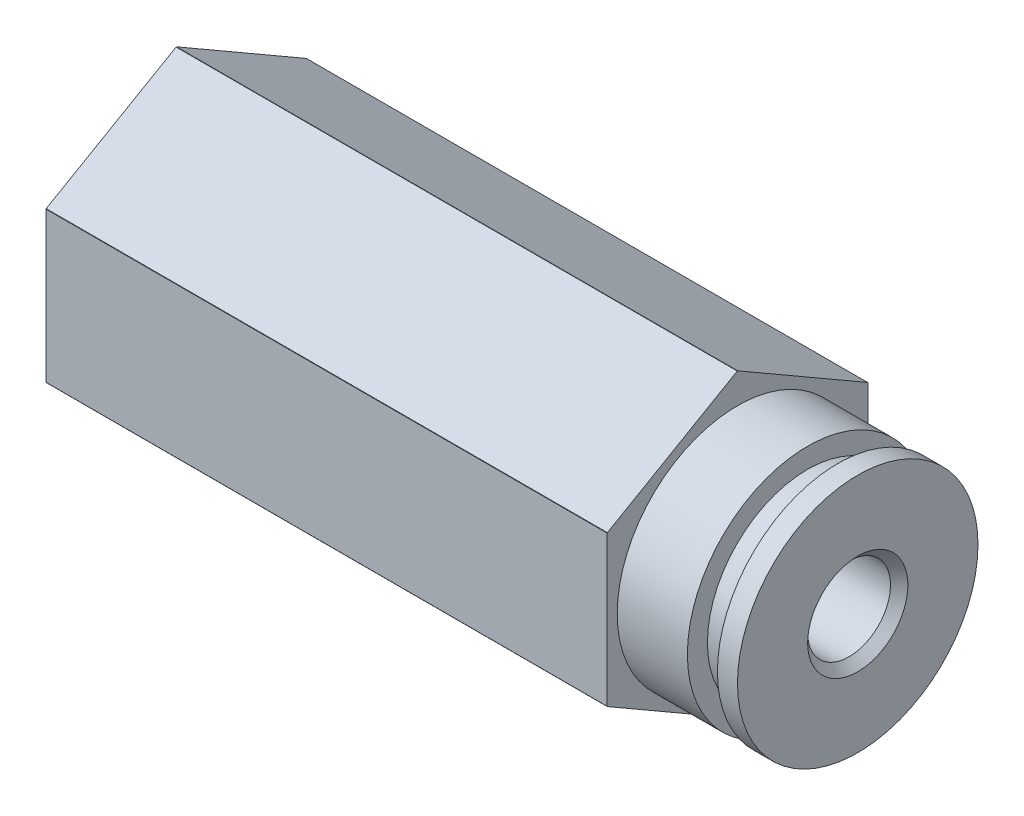
ISO-10303-21;
HEADER;
FILE_DESCRIPTION(('STEP AP214'),'2;1');
FILE_NAME('part.step','',(''),(''),'','','');
FILE_SCHEMA(('AUTOMOTIVE_DESIGN { 1 0 10303 214 1 1 1 1 }'));
ENDSEC;
DATA;
#1=APPLICATION_CONTEXT('core data for automotive mechanical design processes');
#2=APPLICATION_PROTOCOL_DEFINITION('international standard','automotive_design',2000,#1);
#3=PRODUCT_CONTEXT('',#1,'mechanical');
#4=PRODUCT('Part','Part','',(#3));
#5=PRODUCT_RELATED_PRODUCT_CATEGORY('part','',(#4));
#6=PRODUCT_DEFINITION_FORMATION('','',#4);
#7=PRODUCT_DEFINITION_CONTEXT('part definition',#1,'design');
#8=PRODUCT_DEFINITION('design','',#6,#7);
#9=PRODUCT_DEFINITION_SHAPE('','',#8);
#10=(LENGTH_UNIT() NAMED_UNIT(*) SI_UNIT(.MILLI.,.METRE.));
#11=(NAMED_UNIT(*) PLANE_ANGLE_UNIT() SI_UNIT($,.RADIAN.));
#12=(NAMED_UNIT(*) SI_UNIT($,.STERADIAN.) SOLID_ANGLE_UNIT());
#13=UNCERTAINTY_MEASURE_WITH_UNIT(LENGTH_MEASURE(1.E-05),#10,'distance_accuracy_value','');
#14=(GEOMETRIC_REPRESENTATION_CONTEXT(3) GLOBAL_UNCERTAINTY_ASSIGNED_CONTEXT((#13)) GLOBAL_UNIT_ASSIGNED_CONTEXT((#10,
#11,#12)) REPRESENTATION_CONTEXT('',''));
#15=CARTESIAN_POINT('',(0.,0.,0.));
#16=DIRECTION('',(0.,0.,1.));
#17=DIRECTION('',(1.,0.,0.));
#18=AXIS2_PLACEMENT_3D('',#15,#16,#17);
#19=CARTESIAN_POINT('',(34.,0.,0.));
#20=DIRECTION('',(-1.,0.,0.));
#21=DIRECTION('',(0.,0.,1.));
#22=AXIS2_PLACEMENT_3D('',#19,#20,#21);
#23=CYLINDRICAL_SURFACE('',#22,7.4999999999999);
#24=CARTESIAN_POINT('',(28.,0.,0.));
#25=DIRECTION('',(-1.,0.,0.));
#26=DIRECTION('',(0.,0.,1.));
#27=AXIS2_PLACEMENT_3D('',#24,#25,#26);
#28=CIRCLE('',#27,7.4999999999999);
#29=CARTESIAN_POINT('',(28.,-3.75833643121203,6.49037034920373));
#30=VERTEX_POINT('',#29);
#31=CARTESIAN_POINT('',(28.,-3.74165738677374,6.5));
#32=VERTEX_POINT('',#31);
#33=EDGE_CURVE('E180',#30,#32,#28,.T.);
#34=ORIENTED_EDGE('',*,*,#33,.T.);
#35=DIRECTION('',(-1.,0.,0.));
#36=VECTOR('',#35,1.);
#37=CARTESIAN_POINT('',(34.,-3.74165738677374,6.5));
#38=LINE('',#37,#36);
#39=CARTESIAN_POINT('',(0.,-3.74165738677374,6.5));
#40=VERTEX_POINT('',#39);
#41=EDGE_CURVE('E51',#32,#40,#38,.T.);
#42=ORIENTED_EDGE('',*,*,#41,.T.);
#43=CARTESIAN_POINT('',(0.,0.,0.));
#44=DIRECTION('',(-1.,0.,0.));
#45=DIRECTION('',(0.,0.,1.));
#46=AXIS2_PLACEMENT_3D('',#43,#44,#45);
#47=CIRCLE('',#46,7.4999999999999);
#48=CARTESIAN_POINT('',(0.,-3.75833643121203,6.49037034920373));
#49=VERTEX_POINT('',#48);
#50=EDGE_CURVE('E155',#49,#40,#47,.T.);
#51=ORIENTED_EDGE('',*,*,#50,.F.);
#52=DIRECTION('',(-1.,0.,0.));
#53=VECTOR('',#52,1.);
#54=CARTESIAN_POINT('',(34.,-3.75833643121203,6.49037034920373));
#55=LINE('',#54,#53);
#56=EDGE_CURVE('E228',#49,#30,#55,.F.);
#57=ORIENTED_EDGE('',*,*,#56,.T.);
#58=EDGE_LOOP('',(#34,#42,#51,#57));
#59=FACE_BOUND('',#58,.T.);
#60=ADVANCED_FACE('F36',(#59),#23,.T.);
#61=CARTESIAN_POINT('',(28.,-7.49999381798572,-0.00962965079618257));
#62=VERTEX_POINT('',#61);
#63=CARTESIAN_POINT('',(28.,-7.49999381798572,0.00962965079618272));
#64=VERTEX_POINT('',#63);
#65=EDGE_CURVE('E178',#62,#64,#28,.T.);
#66=ORIENTED_EDGE('',*,*,#65,.T.);
#67=DIRECTION('',(-1.,0.,0.));
#68=VECTOR('',#67,1.);
#69=CARTESIAN_POINT('',(34.,-7.49999381798572,0.00962965079618272));
#70=LINE('',#69,#68);
#71=CARTESIAN_POINT('',(0.,-7.49999381798572,0.00962965079618142));
#72=VERTEX_POINT('',#71);
#73=EDGE_CURVE('E58',#64,#72,#70,.T.);
#74=ORIENTED_EDGE('',*,*,#73,.T.);
#75=CARTESIAN_POINT('',(0.,-7.49999381798572,-0.00962965079618419));
#76=VERTEX_POINT('',#75);
#77=EDGE_CURVE('E199',#76,#72,#47,.T.);
#78=ORIENTED_EDGE('',*,*,#77,.F.);
#79=DIRECTION('',(-1.,0.,0.));
#80=VECTOR('',#79,1.);
#81=CARTESIAN_POINT('',(34.,-7.49999381798572,-0.00962965079618489));
#82=LINE('',#81,#80);
#83=EDGE_CURVE('E187',#76,#62,#82,.F.);
#84=ORIENTED_EDGE('',*,*,#83,.T.);
#85=EDGE_LOOP('',(#66,#74,#78,#84));
#86=FACE_BOUND('',#85,.T.);
#87=ADVANCED_FACE('F184',(#86),#23,.T.);
#88=CARTESIAN_POINT('',(28.,-3.74165738677374,-6.5));
#89=VERTEX_POINT('',#88);
#90=CARTESIAN_POINT('',(28.,-3.75833643121203,-6.49037034920373));
#91=VERTEX_POINT('',#90);
#92=EDGE_CURVE('E188',#89,#91,#28,.T.);
#93=ORIENTED_EDGE('',*,*,#92,.T.);
#94=DIRECTION('',(-1.,0.,0.));
#95=VECTOR('',#94,1.);
#96=CARTESIAN_POINT('',(34.,-3.75833643121203,-6.49037034920373));
#97=LINE('',#96,#95);
#98=CARTESIAN_POINT('',(0.,-3.75833643121203,-6.49037034920373));
#99=VERTEX_POINT('',#98);
#100=EDGE_CURVE('E226',#91,#99,#97,.T.);
#101=ORIENTED_EDGE('',*,*,#100,.T.);
#102=CARTESIAN_POINT('',(0.,-3.74165738677374,-6.5));
#103=VERTEX_POINT('',#102);
#104=EDGE_CURVE('E157',#103,#99,#47,.T.);
#105=ORIENTED_EDGE('',*,*,#104,.F.);
#106=DIRECTION('',(-1.,0.,0.));
#107=VECTOR('',#106,1.);
#108=CARTESIAN_POINT('',(34.,-3.74165738677374,-6.5));
#109=LINE('',#108,#107);
#110=EDGE_CURVE('E213',#103,#89,#109,.F.);
#111=ORIENTED_EDGE('',*,*,#110,.T.);
#112=EDGE_LOOP('',(#93,#101,#105,#111));
#113=FACE_BOUND('',#112,.T.);
#114=ADVANCED_FACE('F217',(#113),#23,.T.);
#115=CARTESIAN_POINT('',(28.,3.75833643121203,-6.49037034920373));
#116=VERTEX_POINT('',#115);
#117=CARTESIAN_POINT('',(28.,3.74165738677374,-6.5));
#118=VERTEX_POINT('',#117);
#119=EDGE_CURVE('E190',#116,#118,#28,.T.);
#120=ORIENTED_EDGE('',*,*,#119,.T.);
#121=DIRECTION('',(-1.,0.,0.));
#122=VECTOR('',#121,1.);
#123=CARTESIAN_POINT('',(34.,3.74165738677374,-6.5));
#124=LINE('',#123,#122);
#125=CARTESIAN_POINT('',(0.,3.74165738677374,-6.5));
#126=VERTEX_POINT('',#125);
#127=EDGE_CURVE('E207',#118,#126,#124,.T.);
#128=ORIENTED_EDGE('',*,*,#127,.T.);
#129=CARTESIAN_POINT('',(0.,3.75833643121203,-6.49037034920373));
#130=VERTEX_POINT('',#129);
#131=EDGE_CURVE('E153',#130,#126,#47,.T.);
#132=ORIENTED_EDGE('',*,*,#131,.F.);
#133=DIRECTION('',(-1.,0.,0.));
#134=VECTOR('',#133,1.);
#135=CARTESIAN_POINT('',(34.,3.75833643121203,-6.49037034920373));
#136=LINE('',#135,#134);
#137=EDGE_CURVE('E208',#130,#116,#136,.F.);
#138=ORIENTED_EDGE('',*,*,#137,.T.);
#139=EDGE_LOOP('',(#120,#128,#132,#138));
#140=FACE_BOUND('',#139,.T.);
#141=ADVANCED_FACE('F205',(#140),#23,.T.);
#142=CARTESIAN_POINT('',(28.,7.49999381798572,0.00962965079618419));
#143=VERTEX_POINT('',#142);
#144=CARTESIAN_POINT('',(28.,7.49999381798572,-0.00962965079618489));
#145=VERTEX_POINT('',#144);
#146=EDGE_CURVE('E196',#143,#145,#28,.T.);
#147=ORIENTED_EDGE('',*,*,#146,.T.);
#148=DIRECTION('',(-1.,0.,0.));
#149=VECTOR('',#148,1.);
#150=CARTESIAN_POINT('',(34.,7.49999381798572,-0.00962965079618272));
#151=LINE('',#150,#149);
#152=CARTESIAN_POINT('',(0.,7.49999381798572,-0.00962965079618142));
#153=VERTEX_POINT('',#152);
#154=EDGE_CURVE('E152',#145,#153,#151,.T.);
#155=ORIENTED_EDGE('',*,*,#154,.T.);
#156=CARTESIAN_POINT('',(0.,7.49999381798572,0.00962965079618419));
#157=VERTEX_POINT('',#156);
#158=EDGE_CURVE('E144',#157,#153,#47,.T.);
#159=ORIENTED_EDGE('',*,*,#158,.F.);
#160=DIRECTION('',(-1.,0.,0.));
#161=VECTOR('',#160,1.);
#162=CARTESIAN_POINT('',(34.,7.49999381798572,0.00962965079618489));
#163=LINE('',#162,#161);
#164=EDGE_CURVE('E126',#157,#143,#163,.F.);
#165=ORIENTED_EDGE('',*,*,#164,.T.);
#166=EDGE_LOOP('',(#147,#155,#159,#165));
#167=FACE_BOUND('',#166,.T.);
#168=ADVANCED_FACE('F151',(#167),#23,.T.);
#169=CARTESIAN_POINT('',(0.,0.,0.));
#170=DIRECTION('',(1.,0.,0.));
#171=DIRECTION('',(0.,0.,-1.));
#172=AXIS2_PLACEMENT_3D('',#169,#170,#171);
#173=PLANE('',#172);
#174=CARTESIAN_POINT('',(0.,4.,0.));
#175=DIRECTION('',(1.,0.,0.));
#176=DIRECTION('',(0.,0.,-1.));
#177=AXIS2_PLACEMENT_3D('',#174,#175,#176);
#178=CIRCLE('',#177,0.4);
#179=CARTESIAN_POINT('',(0.,4.,-0.4));
#180=VERTEX_POINT('',#179);
#181=EDGE_CURVE('E573',#180,#180,#178,.T.);
#182=ORIENTED_EDGE('',*,*,#181,.T.);
#183=EDGE_LOOP('',(#182));
#184=FACE_BOUND('',#183,.T.);
#185=CARTESIAN_POINT('',(0.,0.,0.));
#186=DIRECTION('',(-1.,0.,0.));
#187=DIRECTION('',(0.,0.,1.));
#188=AXIS2_PLACEMENT_3D('',#185,#186,#187);
#189=CIRCLE('',#188,2.4999999999999);
#190=CARTESIAN_POINT('',(0.,0.,2.4999999999999));
#191=VERTEX_POINT('',#190);
#192=EDGE_CURVE('E252',#191,#191,#189,.T.);
#193=ORIENTED_EDGE('',*,*,#192,.F.);
#194=EDGE_LOOP('',(#193));
#195=FACE_BOUND('',#194,.T.);
#196=ORIENTED_EDGE('',*,*,#50,.T.);
#197=DIRECTION('',(0.,-1.,0.));
#198=VECTOR('',#197,1.);
#199=CARTESIAN_POINT('',(0.,3.7527767497326,6.5));
#200=LINE('',#199,#198);
#201=CARTESIAN_POINT('',(0.,3.74165738677374,6.5));
#202=VERTEX_POINT('',#201);
#203=EDGE_CURVE('E572',#202,#40,#200,.T.);
#204=ORIENTED_EDGE('',*,*,#203,.F.);
#205=CARTESIAN_POINT('',(0.,3.75833643121203,6.49037034920373));
#206=VERTEX_POINT('',#205);
#207=EDGE_CURVE('E147',#202,#206,#47,.T.);
#208=ORIENTED_EDGE('',*,*,#207,.T.);
#209=DIRECTION('',(0.,-0.499999999999993,0.866025403784443));
#210=VECTOR('',#209,1.);
#211=CARTESIAN_POINT('',(0.,7.5055534994651,0.));
#212=LINE('',#211,#210);
#213=EDGE_CURVE('E129',#157,#206,#212,.T.);
#214=ORIENTED_EDGE('',*,*,#213,.F.);
#215=ORIENTED_EDGE('',*,*,#158,.T.);
#216=DIRECTION('',(0.,0.499999999999993,0.866025403784443));
#217=VECTOR('',#216,1.);
#218=CARTESIAN_POINT('',(0.,3.7527767497326,-6.5));
#219=LINE('',#218,#217);
#220=EDGE_CURVE('E148',#130,#153,#219,.T.);
#221=ORIENTED_EDGE('',*,*,#220,.F.);
#222=ORIENTED_EDGE('',*,*,#131,.T.);
#223=DIRECTION('',(0.,1.,0.));
#224=VECTOR('',#223,1.);
#225=CARTESIAN_POINT('',(0.,-3.7527767497326,-6.5));
#226=LINE('',#225,#224);
#227=EDGE_CURVE('E583',#103,#126,#226,.T.);
#228=ORIENTED_EDGE('',*,*,#227,.F.);
#229=ORIENTED_EDGE('',*,*,#104,.T.);
#230=DIRECTION('',(0.,0.499999999999993,-0.866025403784443));
#231=VECTOR('',#230,1.);
#232=CARTESIAN_POINT('',(0.,-7.5055534994651,0.));
#233=LINE('',#232,#231);
#234=EDGE_CURVE('E581',#76,#99,#233,.T.);
#235=ORIENTED_EDGE('',*,*,#234,.F.);
#236=ORIENTED_EDGE('',*,*,#77,.T.);
#237=DIRECTION('',(0.,-0.499999999999993,-0.866025403784443));
#238=VECTOR('',#237,1.);
#239=CARTESIAN_POINT('',(0.,-3.7527767497326,6.5));
#240=LINE('',#239,#238);
#241=EDGE_CURVE('E575',#49,#72,#240,.T.);
#242=ORIENTED_EDGE('',*,*,#241,.F.);
#243=EDGE_LOOP('',(#196,#204,#208,#214,#215,#221,#222,#228,#229,#235,#236,#242));
#244=FACE_BOUND('',#243,.T.);
#245=ADVANCED_FACE('F38',(#184,#195,#244),#173,.F.);
#246=ORIENTED_EDGE('',*,*,#207,.F.);
#247=DIRECTION('',(-1.,0.,0.));
#248=VECTOR('',#247,1.);
#249=CARTESIAN_POINT('',(34.,3.74165738677374,6.5));
#250=LINE('',#249,#248);
#251=CARTESIAN_POINT('',(28.,3.74165738677374,6.5));
#252=VERTEX_POINT('',#251);
#253=EDGE_CURVE('E231',#202,#252,#250,.F.);
#254=ORIENTED_EDGE('',*,*,#253,.T.);
#255=CARTESIAN_POINT('',(28.,3.75833643121203,6.49037034920373));
#256=VERTEX_POINT('',#255);
#257=EDGE_CURVE('E160',#252,#256,#28,.T.);
#258=ORIENTED_EDGE('',*,*,#257,.T.);
#259=DIRECTION('',(-1.,0.,0.));
#260=VECTOR('',#259,1.);
#261=CARTESIAN_POINT('',(34.,3.75833643121203,6.49037034920373));
#262=LINE('',#261,#260);
#263=EDGE_CURVE('E137',#256,#206,#262,.T.);
#264=ORIENTED_EDGE('',*,*,#263,.T.);
#265=EDGE_LOOP('',(#246,#254,#258,#264));
#266=FACE_BOUND('',#265,.T.);
#267=ADVANCED_FACE('F308',(#266),#23,.T.);
#268=CARTESIAN_POINT('',(28.,7.4999999999999,0.));
#269=DIRECTION('',(-1.,0.,0.));
#270=DIRECTION('',(0.,0.,1.));
#271=AXIS2_PLACEMENT_3D('',#268,#269,#270);
#272=PLANE('',#271);
#273=ORIENTED_EDGE('',*,*,#257,.F.);
#274=DIRECTION('',(0.,-1.,0.));
#275=VECTOR('',#274,1.);
#276=CARTESIAN_POINT('',(28.,7.4999999999999,6.5));
#277=LINE('',#276,#275);
#278=EDGE_CURVE('E11',#252,#32,#277,.T.);
#279=ORIENTED_EDGE('',*,*,#278,.T.);
#280=ORIENTED_EDGE('',*,*,#33,.F.);
#281=DIRECTION('',(0.,-0.499999999999993,-0.866025403784443));
#282=VECTOR('',#281,1.);
#283=CARTESIAN_POINT('',(28.,-3.75416512459895,6.49759526419153));
#284=LINE('',#283,#282);
#285=EDGE_CURVE('E44',#30,#64,#284,.T.);
#286=ORIENTED_EDGE('',*,*,#285,.T.);
#287=ORIENTED_EDGE('',*,*,#65,.F.);
#288=DIRECTION('',(0.,0.499999999999993,-0.866025403784443));
#289=VECTOR('',#288,1.);
#290=CARTESIAN_POINT('',(28.,-3.75416512459895,-6.49759526419153));
#291=LINE('',#290,#289);
#292=EDGE_CURVE('E169',#62,#91,#291,.T.);
#293=ORIENTED_EDGE('',*,*,#292,.T.);
#294=ORIENTED_EDGE('',*,*,#92,.F.);
#295=DIRECTION('',(0.,1.,0.));
#296=VECTOR('',#295,1.);
#297=CARTESIAN_POINT('',(28.,7.4999999999999,-6.5));
#298=LINE('',#297,#296);
#299=EDGE_CURVE('E166',#89,#118,#298,.T.);
#300=ORIENTED_EDGE('',*,*,#299,.T.);
#301=ORIENTED_EDGE('',*,*,#119,.F.);
#302=DIRECTION('',(0.,0.499999999999993,0.866025403784443));
#303=VECTOR('',#302,1.);
#304=CARTESIAN_POINT('',(28.,7.5041651245988,-0.00240473580838328));
#305=LINE('',#304,#303);
#306=EDGE_CURVE('E163',#116,#145,#305,.T.);
#307=ORIENTED_EDGE('',*,*,#306,.T.);
#308=ORIENTED_EDGE('',*,*,#146,.F.);
#309=DIRECTION('',(0.,-0.499999999999993,0.866025403784443));
#310=VECTOR('',#309,1.);
#311=CARTESIAN_POINT('',(28.,7.5041651245988,0.00240473580838334));
#312=LINE('',#311,#310);
#313=EDGE_CURVE('E132',#143,#256,#312,.T.);
#314=ORIENTED_EDGE('',*,*,#313,.T.);
#315=EDGE_LOOP('',(#273,#279,#280,#286,#287,#293,#294,#300,#301,#307,#308,#314));
#316=FACE_BOUND('',#315,.T.);
#317=CARTESIAN_POINT('',(28.,0.,0.));
#318=DIRECTION('',(-1.,0.,0.));
#319=DIRECTION('',(0.,0.,1.));
#320=AXIS2_PLACEMENT_3D('',#317,#318,#319);
#321=CIRCLE('',#320,6.0000000000001);
#322=CARTESIAN_POINT('',(28.,0.,6.0000000000001));
#323=VERTEX_POINT('',#322);
#324=EDGE_CURVE('E191',#323,#323,#321,.T.);
#325=ORIENTED_EDGE('',*,*,#324,.T.);
#326=EDGE_LOOP('',(#325));
#327=FACE_BOUND('',#326,.T.);
#328=ADVANCED_FACE('F176',(#316,#327),#272,.F.);
#329=CARTESIAN_POINT('',(34.,0.,0.));
#330=DIRECTION('',(-1.,0.,0.));
#331=DIRECTION('',(0.,0.,1.));
#332=AXIS2_PLACEMENT_3D('',#329,#330,#331);
#333=CYLINDRICAL_SURFACE('',#332,6.00000000000005);
#334=ORIENTED_EDGE('',*,*,#324,.F.);
#335=EDGE_LOOP('',(#334));
#336=FACE_BOUND('',#335,.T.);
#337=CARTESIAN_POINT('',(31.5,0.,0.));
#338=DIRECTION('',(-1.,0.,0.));
#339=DIRECTION('',(0.,0.,1.));
#340=AXIS2_PLACEMENT_3D('',#337,#338,#339);
#341=CIRCLE('',#340,6.);
#342=CARTESIAN_POINT('',(31.5,0.,6.));
#343=VERTEX_POINT('',#342);
#344=EDGE_CURVE('E194',#343,#343,#341,.T.);
#345=ORIENTED_EDGE('',*,*,#344,.T.);
#346=EDGE_LOOP('',(#345));
#347=FACE_BOUND('',#346,.T.);
#348=ADVANCED_FACE('F270',(#336,#347),#333,.T.);
#349=CARTESIAN_POINT('',(31.5,6.,0.));
#350=DIRECTION('',(-1.,0.,0.));
#351=DIRECTION('',(0.,0.,1.));
#352=AXIS2_PLACEMENT_3D('',#349,#350,#351);
#353=PLANE('',#352);
#354=ORIENTED_EDGE('',*,*,#344,.F.);
#355=EDGE_LOOP('',(#354));
#356=FACE_BOUND('',#355,.T.);
#357=CARTESIAN_POINT('',(31.5,0.,0.));
#358=DIRECTION('',(-1.,0.,0.));
#359=DIRECTION('',(0.,0.,1.));
#360=AXIS2_PLACEMENT_3D('',#357,#358,#359);
#361=CIRCLE('',#360,5.);
#362=CARTESIAN_POINT('',(31.5,0.,5.));
#363=VERTEX_POINT('',#362);
#364=EDGE_CURVE('E264',#363,#363,#361,.T.);
#365=ORIENTED_EDGE('',*,*,#364,.T.);
#366=EDGE_LOOP('',(#365));
#367=FACE_BOUND('',#366,.T.);
#368=ADVANCED_FACE('F272',(#356,#367),#353,.F.);
#369=CARTESIAN_POINT('',(34.,0.,0.));
#370=DIRECTION('',(-1.,0.,0.));
#371=DIRECTION('',(0.,0.,1.));
#372=AXIS2_PLACEMENT_3D('',#369,#370,#371);
#373=CYLINDRICAL_SURFACE('',#372,5.);
#374=ORIENTED_EDGE('',*,*,#364,.F.);
#375=EDGE_LOOP('',(#374));
#376=FACE_BOUND('',#375,.T.);
#377=CARTESIAN_POINT('',(33.,0.,0.));
#378=DIRECTION('',(-1.,0.,0.));
#379=DIRECTION('',(0.,0.,1.));
#380=AXIS2_PLACEMENT_3D('',#377,#378,#379);
#381=CIRCLE('',#380,5.);
#382=CARTESIAN_POINT('',(33.,0.,5.));
#383=VERTEX_POINT('',#382);
#384=EDGE_CURVE('E261',#383,#383,#381,.T.);
#385=ORIENTED_EDGE('',*,*,#384,.T.);
#386=EDGE_LOOP('',(#385));
#387=FACE_BOUND('',#386,.T.);
#388=ADVANCED_FACE('F275',(#376,#387),#373,.T.);
#389=CARTESIAN_POINT('',(33.,5.,0.));
#390=DIRECTION('',(1.,0.,0.));
#391=DIRECTION('',(0.,0.,-1.));
#392=AXIS2_PLACEMENT_3D('',#389,#390,#391);
#393=PLANE('',#392);
#394=ORIENTED_EDGE('',*,*,#384,.F.);
#395=EDGE_LOOP('',(#394));
#396=FACE_BOUND('',#395,.T.);
#397=CARTESIAN_POINT('',(33.,0.,0.));
#398=DIRECTION('',(-1.,0.,0.));
#399=DIRECTION('',(0.,0.,1.));
#400=AXIS2_PLACEMENT_3D('',#397,#398,#399);
#401=CIRCLE('',#400,6.);
#402=CARTESIAN_POINT('',(33.,0.,6.));
#403=VERTEX_POINT('',#402);
#404=EDGE_CURVE('E258',#403,#403,#401,.T.);
#405=ORIENTED_EDGE('',*,*,#404,.T.);
#406=EDGE_LOOP('',(#405));
#407=FACE_BOUND('',#406,.T.);
#408=ADVANCED_FACE('F281',(#396,#407),#393,.F.);
#409=CARTESIAN_POINT('',(34.,0.,0.));
#410=DIRECTION('',(-1.,0.,0.));
#411=DIRECTION('',(0.,0.,1.));
#412=AXIS2_PLACEMENT_3D('',#409,#410,#411);
#413=CYLINDRICAL_SURFACE('',#412,6.);
#414=ORIENTED_EDGE('',*,*,#404,.F.);
#415=EDGE_LOOP('',(#414));
#416=FACE_BOUND('',#415,.T.);
#417=CARTESIAN_POINT('',(34.,0.,0.));
#418=DIRECTION('',(-1.,0.,0.));
#419=DIRECTION('',(0.,0.,1.));
#420=AXIS2_PLACEMENT_3D('',#417,#418,#419);
#421=CIRCLE('',#420,6.);
#422=CARTESIAN_POINT('',(34.,0.,6.));
#423=VERTEX_POINT('',#422);
#424=EDGE_CURVE('E255',#423,#423,#421,.T.);
#425=ORIENTED_EDGE('',*,*,#424,.T.);
#426=EDGE_LOOP('',(#425));
#427=FACE_BOUND('',#426,.T.);
#428=ADVANCED_FACE('F287',(#416,#427),#413,.T.);
#429=CARTESIAN_POINT('',(34.,6.,0.));
#430=DIRECTION('',(-1.,0.,0.));
#431=DIRECTION('',(0.,0.,1.));
#432=AXIS2_PLACEMENT_3D('',#429,#430,#431);
#433=PLANE('',#432);
#434=CARTESIAN_POINT('',(34.,0.,0.));
#435=DIRECTION('',(-1.,0.,0.));
#436=DIRECTION('',(0.,0.,1.));
#437=AXIS2_PLACEMENT_3D('',#434,#435,#436);
#438=CIRCLE('',#437,2.4999999999999);
#439=CARTESIAN_POINT('',(34.,0.,2.4999999999999));
#440=VERTEX_POINT('',#439);
#441=EDGE_CURVE('E240',#440,#440,#438,.T.);
#442=ORIENTED_EDGE('',*,*,#441,.T.);
#443=EDGE_LOOP('',(#442));
#444=FACE_BOUND('',#443,.T.);
#445=ORIENTED_EDGE('',*,*,#424,.F.);
#446=EDGE_LOOP('',(#445));
#447=FACE_BOUND('',#446,.T.);
#448=ADVANCED_FACE('F293',(#444,#447),#433,.F.);
#449=CARTESIAN_POINT('',(23.5,0.,0.));
#450=DIRECTION('',(-1.,0.,0.));
#451=DIRECTION('',(0.,0.,1.));
#452=AXIS2_PLACEMENT_3D('',#449,#450,#451);
#453=CYLINDRICAL_SURFACE('',#452,2.4999999999999);
#454=ORIENTED_EDGE('',*,*,#192,.T.);
#455=EDGE_LOOP('',(#454));
#456=FACE_BOUND('',#455,.T.);
#457=CARTESIAN_POINT('',(6.5,0.,0.));
#458=DIRECTION('',(-1.,0.,0.));
#459=DIRECTION('',(0.,0.,1.));
#460=AXIS2_PLACEMENT_3D('',#457,#458,#459);
#461=CIRCLE('',#460,2.4999999999999);
#462=CARTESIAN_POINT('',(6.5,0.,2.4999999999999));
#463=VERTEX_POINT('',#462);
#464=EDGE_CURVE('E249',#463,#463,#461,.T.);
#465=ORIENTED_EDGE('',*,*,#464,.F.);
#466=EDGE_LOOP('',(#465));
#467=FACE_BOUND('',#466,.T.);
#468=ADVANCED_FACE('F298',(#456,#467),#453,.F.);
#469=CARTESIAN_POINT('',(6.5,2.4999999999999,0.));
#470=DIRECTION('',(1.,0.,0.));
#471=DIRECTION('',(0.,0.,-1.));
#472=AXIS2_PLACEMENT_3D('',#469,#470,#471);
#473=PLANE('',#472);
#474=ORIENTED_EDGE('',*,*,#464,.T.);
#475=EDGE_LOOP('',(#474));
#476=FACE_BOUND('',#475,.T.);
#477=CARTESIAN_POINT('',(6.5,0.,0.));
#478=DIRECTION('',(-1.,0.,0.));
#479=DIRECTION('',(0.,0.,1.));
#480=AXIS2_PLACEMENT_3D('',#477,#478,#479);
#481=CIRCLE('',#480,5.);
#482=CARTESIAN_POINT('',(6.5,0.,5.));
#483=VERTEX_POINT('',#482);
#484=EDGE_CURVE('E246',#483,#483,#481,.T.);
#485=ORIENTED_EDGE('',*,*,#484,.F.);
#486=EDGE_LOOP('',(#485));
#487=FACE_BOUND('',#486,.T.);
#488=ADVANCED_FACE('F304',(#476,#487),#473,.T.);
#489=CARTESIAN_POINT('',(23.5,0.,0.));
#490=DIRECTION('',(-1.,0.,0.));
#491=DIRECTION('',(0.,0.,1.));
#492=AXIS2_PLACEMENT_3D('',#489,#490,#491);
#493=CYLINDRICAL_SURFACE('',#492,5.);
#494=ORIENTED_EDGE('',*,*,#484,.T.);
#495=EDGE_LOOP('',(#494));
#496=FACE_BOUND('',#495,.T.);
#497=CARTESIAN_POINT('',(23.5,0.,0.));
#498=DIRECTION('',(-1.,0.,0.));
#499=DIRECTION('',(0.,0.,1.));
#500=AXIS2_PLACEMENT_3D('',#497,#498,#499);
#501=CIRCLE('',#500,5.);
#502=CARTESIAN_POINT('',(23.5,0.,5.));
#503=VERTEX_POINT('',#502);
#504=EDGE_CURVE('E243',#503,#503,#501,.T.);
#505=ORIENTED_EDGE('',*,*,#504,.F.);
#506=EDGE_LOOP('',(#505));
#507=FACE_BOUND('',#506,.T.);
#508=ADVANCED_FACE('F463',(#496,#507),#493,.F.);
#509=CARTESIAN_POINT('',(23.5,5.,0.));
#510=DIRECTION('',(-1.,0.,0.));
#511=DIRECTION('',(0.,0.,1.));
#512=AXIS2_PLACEMENT_3D('',#509,#510,#511);
#513=PLANE('',#512);
#514=ORIENTED_EDGE('',*,*,#504,.T.);
#515=EDGE_LOOP('',(#514));
#516=FACE_BOUND('',#515,.T.);
#517=ADVANCED_FACE('F459',(#516),#513,.T.);
#518=CARTESIAN_POINT('',(34.,0.,0.));
#519=DIRECTION('',(1.,0.,0.));
#520=DIRECTION('',(0.,0.,-1.));
#521=AXIS2_PLACEMENT_3D('',#518,#519,#520);
#522=CONICAL_SURFACE('',#521,2.4999999999999,0.785398163397442);
#523=CARTESIAN_POINT('',(33.566999999994,0.,0.));
#524=DIRECTION('',(-1.,0.,0.));
#525=DIRECTION('',(0.,0.,1.));
#526=AXIS2_PLACEMENT_3D('',#523,#524,#525);
#527=CIRCLE('',#526,2.0669999999939);
#528=CARTESIAN_POINT('',(33.566999999994,0.,2.0669999999939));
#529=VERTEX_POINT('',#528);
#530=EDGE_CURVE('E237',#529,#529,#527,.T.);
#531=ORIENTED_EDGE('',*,*,#530,.T.);
#532=EDGE_LOOP('',(#531));
#533=FACE_BOUND('',#532,.T.);
#534=ORIENTED_EDGE('',*,*,#441,.F.);
#535=EDGE_LOOP('',(#534));
#536=FACE_BOUND('',#535,.T.);
#537=ADVANCED_FACE('F348',(#533,#536),#522,.F.);
#538=CARTESIAN_POINT('',(34.,0.,0.));
#539=DIRECTION('',(-1.,0.,0.));
#540=DIRECTION('',(0.,0.,1.));
#541=AXIS2_PLACEMENT_3D('',#538,#539,#540);
#542=CYLINDRICAL_SURFACE('',#541,2.06699999999395);
#543=CARTESIAN_POINT('',(29.,0.,0.));
#544=DIRECTION('',(-1.,0.,0.));
#545=DIRECTION('',(0.,0.,1.));
#546=AXIS2_PLACEMENT_3D('',#543,#544,#545);
#547=CIRCLE('',#546,2.066999999994);
#548=CARTESIAN_POINT('',(29.,0.,2.066999999994));
#549=VERTEX_POINT('',#548);
#550=EDGE_CURVE('E234',#549,#549,#547,.T.);
#551=ORIENTED_EDGE('',*,*,#550,.T.);
#552=EDGE_LOOP('',(#551));
#553=FACE_BOUND('',#552,.T.);
#554=ORIENTED_EDGE('',*,*,#530,.F.);
#555=EDGE_LOOP('',(#554));
#556=FACE_BOUND('',#555,.T.);
#557=ADVANCED_FACE('F342',(#553,#556),#542,.F.);
#558=CARTESIAN_POINT('',(29.,0.,0.));
#559=DIRECTION('',(1.,0.,0.));
#560=DIRECTION('',(0.,0.,-1.));
#561=AXIS2_PLACEMENT_3D('',#558,#559,#560);
#562=CONICAL_SURFACE('',#561,2.066999999994,1.04719755119678);
#563=CARTESIAN_POINT('',(27.806616993589,0.,0.));
#564=VERTEX_POINT('',#563);
#565=VERTEX_LOOP('',#564);
#566=FACE_BOUND('',#565,.T.);
#567=ORIENTED_EDGE('',*,*,#550,.F.);
#568=EDGE_LOOP('',(#567));
#569=FACE_BOUND('',#568,.T.);
#570=ADVANCED_FACE('F347',(#566,#569),#562,.F.);
#571=CARTESIAN_POINT('',(28.,7.5055534994651,0.));
#572=DIRECTION('',(0.,-0.866025403784443,-0.499999999999993));
#573=DIRECTION('',(0.,0.499999999999993,-0.866025403784443));
#574=AXIS2_PLACEMENT_3D('',#571,#572,#573);
#575=PLANE('',#574);
#576=ORIENTED_EDGE('',*,*,#313,.F.);
#577=ORIENTED_EDGE('',*,*,#164,.F.);
#578=ORIENTED_EDGE('',*,*,#213,.T.);
#579=ORIENTED_EDGE('',*,*,#263,.F.);
#580=EDGE_LOOP('',(#576,#577,#578,#579));
#581=FACE_BOUND('',#580,.T.);
#582=ADVANCED_FACE('F128',(#581),#575,.F.);
#583=CARTESIAN_POINT('',(28.,3.7527767497326,-6.5));
#584=DIRECTION('',(0.,-0.866025403784443,0.499999999999993));
#585=DIRECTION('',(0.,-0.499999999999993,-0.866025403784443));
#586=AXIS2_PLACEMENT_3D('',#583,#584,#585);
#587=PLANE('',#586);
#588=ORIENTED_EDGE('',*,*,#306,.F.);
#589=ORIENTED_EDGE('',*,*,#137,.F.);
#590=ORIENTED_EDGE('',*,*,#220,.T.);
#591=ORIENTED_EDGE('',*,*,#154,.F.);
#592=EDGE_LOOP('',(#588,#589,#590,#591));
#593=FACE_BOUND('',#592,.T.);
#594=ADVANCED_FACE('F380',(#593),#587,.F.);
#595=CARTESIAN_POINT('',(28.,-3.7527767497326,-6.5));
#596=DIRECTION('',(0.,0.,1.));
#597=DIRECTION('',(1.,0.,0.));
#598=AXIS2_PLACEMENT_3D('',#595,#596,#597);
#599=PLANE('',#598);
#600=ORIENTED_EDGE('',*,*,#299,.F.);
#601=ORIENTED_EDGE('',*,*,#110,.F.);
#602=ORIENTED_EDGE('',*,*,#227,.T.);
#603=ORIENTED_EDGE('',*,*,#127,.F.);
#604=EDGE_LOOP('',(#600,#601,#602,#603));
#605=FACE_BOUND('',#604,.T.);
#606=ADVANCED_FACE('F212',(#605),#599,.F.);
#607=CARTESIAN_POINT('',(28.,-7.5055534994651,0.));
#608=DIRECTION('',(0.,0.866025403784443,0.499999999999993));
#609=DIRECTION('',(0.,-0.499999999999993,0.866025403784443));
#610=AXIS2_PLACEMENT_3D('',#607,#608,#609);
#611=PLANE('',#610);
#612=ORIENTED_EDGE('',*,*,#292,.F.);
#613=ORIENTED_EDGE('',*,*,#83,.F.);
#614=ORIENTED_EDGE('',*,*,#234,.T.);
#615=ORIENTED_EDGE('',*,*,#100,.F.);
#616=EDGE_LOOP('',(#612,#613,#614,#615));
#617=FACE_BOUND('',#616,.T.);
#618=ADVANCED_FACE('F398',(#617),#611,.F.);
#619=CARTESIAN_POINT('',(28.,-3.7527767497326,6.5));
#620=DIRECTION('',(0.,0.866025403784443,-0.499999999999993));
#621=DIRECTION('',(0.,0.499999999999993,0.866025403784443));
#622=AXIS2_PLACEMENT_3D('',#619,#620,#621);
#623=PLANE('',#622);
#624=ORIENTED_EDGE('',*,*,#285,.F.);
#625=ORIENTED_EDGE('',*,*,#56,.F.);
#626=ORIENTED_EDGE('',*,*,#241,.T.);
#627=ORIENTED_EDGE('',*,*,#73,.F.);
#628=EDGE_LOOP('',(#624,#625,#626,#627));
#629=FACE_BOUND('',#628,.T.);
#630=ADVANCED_FACE('F407',(#629),#623,.F.);
#631=CARTESIAN_POINT('',(28.,3.7527767497326,6.5));
#632=DIRECTION('',(0.,0.,-1.));
#633=DIRECTION('',(-1.,0.,0.));
#634=AXIS2_PLACEMENT_3D('',#631,#632,#633);
#635=PLANE('',#634);
#636=ORIENTED_EDGE('',*,*,#278,.F.);
#637=ORIENTED_EDGE('',*,*,#253,.F.);
#638=ORIENTED_EDGE('',*,*,#203,.T.);
#639=ORIENTED_EDGE('',*,*,#41,.F.);
#640=EDGE_LOOP('',(#636,#637,#638,#639));
#641=FACE_BOUND('',#640,.T.);
#642=ADVANCED_FACE('F417',(#641),#635,.F.);
#643=CARTESIAN_POINT('',(3.,4.,0.));
#644=DIRECTION('',(-1.,0.,0.));
#645=DIRECTION('',(0.,0.,1.));
#646=AXIS2_PLACEMENT_3D('',#643,#644,#645);
#647=CYLINDRICAL_SURFACE('',#646,0.4);
#648=CARTESIAN_POINT('',(3.,4.,0.));
#649=DIRECTION('',(1.,0.,0.));
#650=DIRECTION('',(0.,0.,-1.));
#651=AXIS2_PLACEMENT_3D('',#648,#649,#650);
#652=CIRCLE('',#651,0.4);
#653=CARTESIAN_POINT('',(3.,4.,-0.4));
#654=VERTEX_POINT('',#653);
#655=EDGE_CURVE('E571',#654,#654,#652,.T.);
#656=ORIENTED_EDGE('',*,*,#655,.T.);
#657=EDGE_LOOP('',(#656));
#658=FACE_BOUND('',#657,.T.);
#659=ORIENTED_EDGE('',*,*,#181,.F.);
#660=EDGE_LOOP('',(#659));
#661=FACE_BOUND('',#660,.T.);
#662=ADVANCED_FACE('F426',(#658,#661),#647,.F.);
#663=CARTESIAN_POINT('',(3.,4.,0.));
#664=DIRECTION('',(1.,0.,0.));
#665=DIRECTION('',(0.,0.,-1.));
#666=AXIS2_PLACEMENT_3D('',#663,#664,#665);
#667=PLANE('',#666);
#668=ORIENTED_EDGE('',*,*,#655,.F.);
#669=EDGE_LOOP('',(#668));
#670=FACE_BOUND('',#669,.T.);
#671=ADVANCED_FACE('F440',(#670),#667,.F.);
#672=CLOSED_SHELL('',(#60,#87,#114,#141,#168,#245,#267,#328,#348,#368,#388,#408,#428,#448,#468,
#488,#508,#517,#537,#557,#570,#582,#594,#606,#618,#630,#642,#662,#671));
#673=MANIFOLD_SOLID_BREP('B2',#672);
#674=ADVANCED_BREP_SHAPE_REPRESENTATION('',(#18,#673),#14);
#675=SHAPE_DEFINITION_REPRESENTATION(#9,#674);
ENDSEC;
END-ISO-10303-21;
